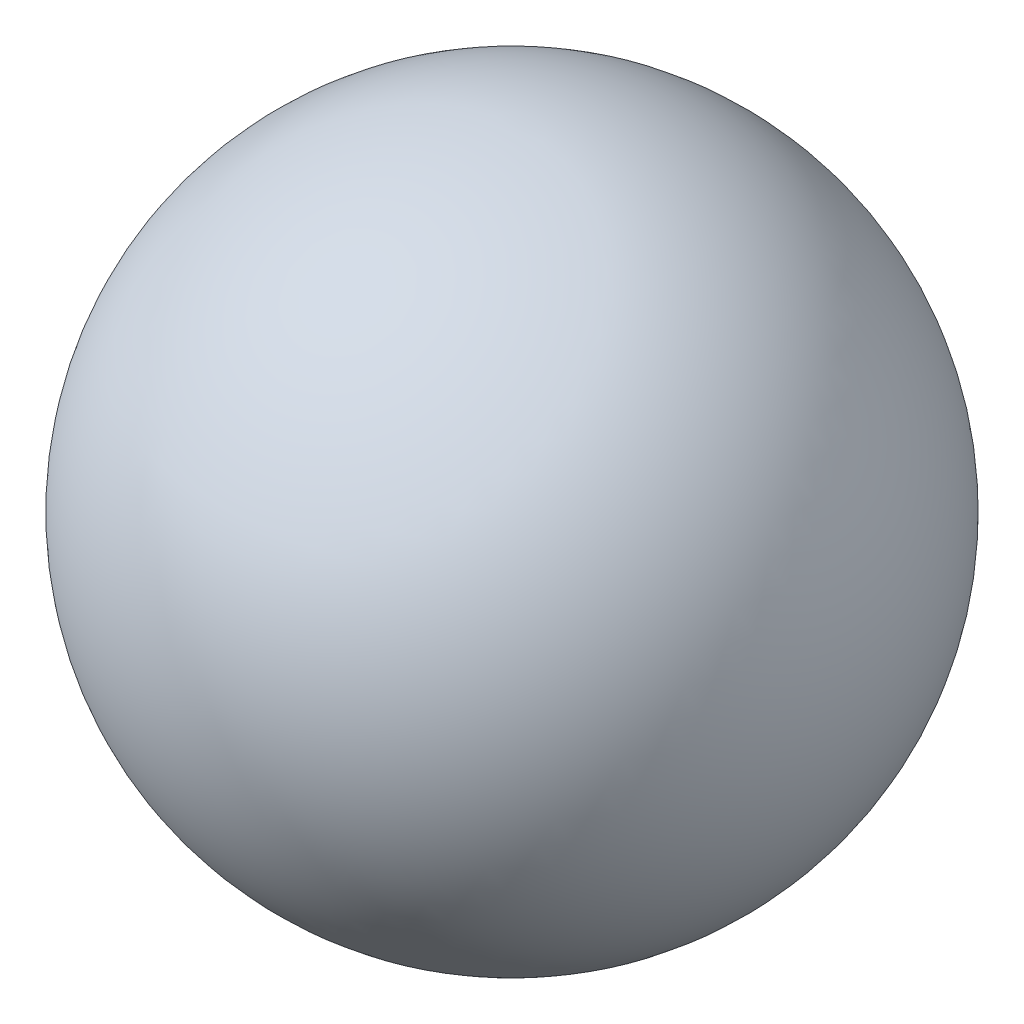
ISO-10303-21;
HEADER;
FILE_DESCRIPTION(('STEP AP214'),'2;1');
FILE_NAME('part.step','',(''),(''),'','','');
FILE_SCHEMA(('AUTOMOTIVE_DESIGN { 1 0 10303 214 1 1 1 1 }'));
ENDSEC;
DATA;
#1=APPLICATION_CONTEXT('core data for automotive mechanical design processes');
#2=APPLICATION_PROTOCOL_DEFINITION('international standard','automotive_design',2000,#1);
#3=PRODUCT_CONTEXT('',#1,'mechanical');
#4=PRODUCT('Part','Part','',(#3));
#5=PRODUCT_RELATED_PRODUCT_CATEGORY('part','',(#4));
#6=PRODUCT_DEFINITION_FORMATION('','',#4);
#7=PRODUCT_DEFINITION_CONTEXT('part definition',#1,'design');
#8=PRODUCT_DEFINITION('design','',#6,#7);
#9=PRODUCT_DEFINITION_SHAPE('','',#8);
#10=(LENGTH_UNIT() NAMED_UNIT(*) SI_UNIT(.MILLI.,.METRE.));
#11=(NAMED_UNIT(*) PLANE_ANGLE_UNIT() SI_UNIT($,.RADIAN.));
#12=(NAMED_UNIT(*) SI_UNIT($,.STERADIAN.) SOLID_ANGLE_UNIT());
#13=UNCERTAINTY_MEASURE_WITH_UNIT(LENGTH_MEASURE(1.E-05),#10,'distance_accuracy_value','');
#14=(GEOMETRIC_REPRESENTATION_CONTEXT(3) GLOBAL_UNCERTAINTY_ASSIGNED_CONTEXT((#13)) GLOBAL_UNIT_ASSIGNED_CONTEXT((#10,
#11,#12)) REPRESENTATION_CONTEXT('',''));
#15=CARTESIAN_POINT('',(0.,0.,0.));
#16=DIRECTION('',(0.,0.,1.));
#17=DIRECTION('',(1.,0.,0.));
#18=AXIS2_PLACEMENT_3D('',#15,#16,#17);
#19=CARTESIAN_POINT('',(0.,0.,0.));
#20=DIRECTION('',(0.,-1.,0.));
#21=DIRECTION('',(1.,0.,0.));
#22=AXIS2_PLACEMENT_3D('',#19,#20,#21);
#23=SPHERICAL_SURFACE('',#22,2.525);
#24=CARTESIAN_POINT('',(0.,-2.525,0.));
#25=VERTEX_POINT('',#24);
#26=VERTEX_LOOP('',#25);
#27=FACE_BOUND('',#26,.T.);
#28=ADVANCED_FACE('F40',(#27),#23,.T.);
#29=CLOSED_SHELL('',(#28));
#30=MANIFOLD_SOLID_BREP('B2',#29);
#31=ADVANCED_BREP_SHAPE_REPRESENTATION('',(#18,#30),#14);
#32=SHAPE_DEFINITION_REPRESENTATION(#9,#31);
ENDSEC;
END-ISO-10303-21;
